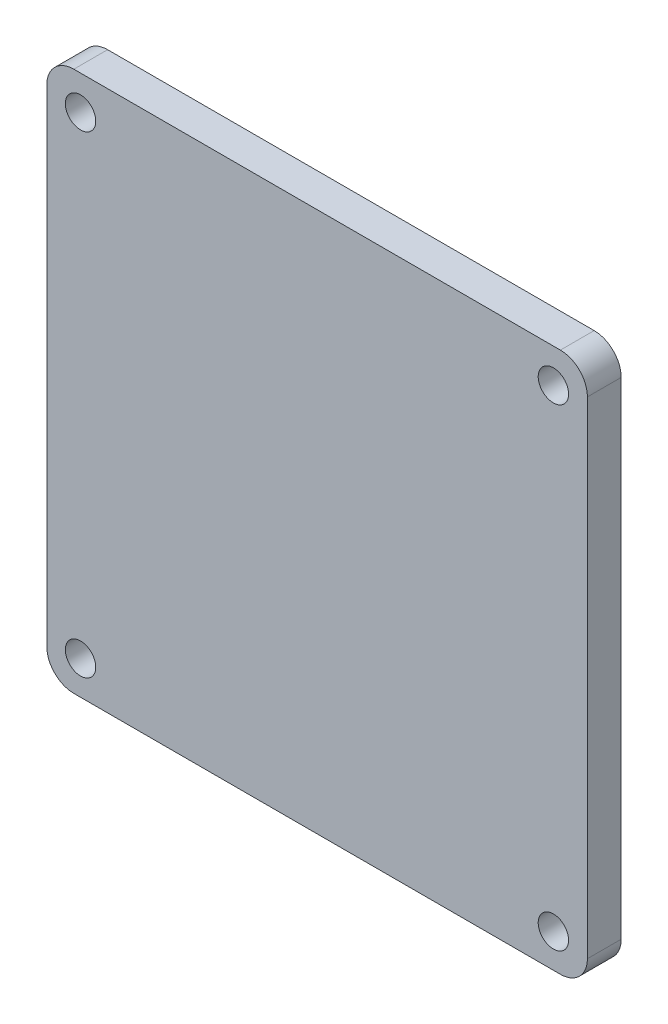
ISO-10303-21;
HEADER;
FILE_DESCRIPTION(('STEP AP214'),'2;1');
FILE_NAME('part.step','',(''),(''),'','','');
FILE_SCHEMA(('AUTOMOTIVE_DESIGN { 1 0 10303 214 1 1 1 1 }'));
ENDSEC;
DATA;
#1=APPLICATION_CONTEXT('core data for automotive mechanical design processes');
#2=APPLICATION_PROTOCOL_DEFINITION('international standard','automotive_design',2000,#1);
#3=PRODUCT_CONTEXT('',#1,'mechanical');
#4=PRODUCT('Part','Part','',(#3));
#5=PRODUCT_RELATED_PRODUCT_CATEGORY('part','',(#4));
#6=PRODUCT_DEFINITION_FORMATION('','',#4);
#7=PRODUCT_DEFINITION_CONTEXT('part definition',#1,'design');
#8=PRODUCT_DEFINITION('design','',#6,#7);
#9=PRODUCT_DEFINITION_SHAPE('','',#8);
#10=(LENGTH_UNIT() NAMED_UNIT(*) SI_UNIT(.MILLI.,.METRE.));
#11=(NAMED_UNIT(*) PLANE_ANGLE_UNIT() SI_UNIT($,.RADIAN.));
#12=(NAMED_UNIT(*) SI_UNIT($,.STERADIAN.) SOLID_ANGLE_UNIT());
#13=UNCERTAINTY_MEASURE_WITH_UNIT(LENGTH_MEASURE(1.E-05),#10,'distance_accuracy_value','');
#14=(GEOMETRIC_REPRESENTATION_CONTEXT(3) GLOBAL_UNCERTAINTY_ASSIGNED_CONTEXT((#13)) GLOBAL_UNIT_ASSIGNED_CONTEXT((#10,
#11,#12)) REPRESENTATION_CONTEXT('',''));
#15=CARTESIAN_POINT('',(0.,0.,0.));
#16=DIRECTION('',(0.,0.,1.));
#17=DIRECTION('',(1.,0.,0.));
#18=AXIS2_PLACEMENT_3D('',#15,#16,#17);
#19=CARTESIAN_POINT('',(-36.,-36.,0.));
#20=DIRECTION('',(0.,0.,-1.));
#21=DIRECTION('',(-1.,0.,0.));
#22=AXIS2_PLACEMENT_3D('',#19,#20,#21);
#23=PLANE('',#22);
#24=CARTESIAN_POINT('',(-35.0076226985767,34.9623801641174,0.));
#25=DIRECTION('',(0.,0.,1.));
#26=DIRECTION('',(1.,0.,0.));
#27=AXIS2_PLACEMENT_3D('',#24,#25,#26);
#28=CIRCLE('',#27,2.24999999999999);
#29=CARTESIAN_POINT('',(-32.7576226985767,34.9623801641174,0.));
#30=VERTEX_POINT('',#29);
#31=EDGE_CURVE('E195',#30,#30,#28,.T.);
#32=ORIENTED_EDGE('',*,*,#31,.T.);
#33=EDGE_LOOP('',(#32));
#34=FACE_BOUND('',#33,.T.);
#35=CARTESIAN_POINT('',(34.9683536446484,34.9623801641172,0.));
#36=DIRECTION('',(0.,0.,1.));
#37=DIRECTION('',(1.,0.,0.));
#38=AXIS2_PLACEMENT_3D('',#35,#36,#37);
#39=CIRCLE('',#38,2.24999999999999);
#40=CARTESIAN_POINT('',(37.2183536446484,34.9623801641172,0.));
#41=VERTEX_POINT('',#40);
#42=EDGE_CURVE('E189',#41,#41,#39,.T.);
#43=ORIENTED_EDGE('',*,*,#42,.T.);
#44=EDGE_LOOP('',(#43));
#45=FACE_BOUND('',#44,.T.);
#46=CARTESIAN_POINT('',(34.9683536446482,-35.0238813325822,0.));
#47=DIRECTION('',(0.,0.,1.));
#48=DIRECTION('',(1.,0.,0.));
#49=AXIS2_PLACEMENT_3D('',#46,#47,#48);
#50=CIRCLE('',#49,2.24999999999999);
#51=CARTESIAN_POINT('',(37.2183536446482,-35.0238813325822,0.));
#52=VERTEX_POINT('',#51);
#53=EDGE_CURVE('E183',#52,#52,#50,.T.);
#54=ORIENTED_EDGE('',*,*,#53,.T.);
#55=EDGE_LOOP('',(#54));
#56=FACE_BOUND('',#55,.T.);
#57=CARTESIAN_POINT('',(-36.,-36.,0.));
#58=DIRECTION('',(0.,0.,1.));
#59=DIRECTION('',(-1.,0.,0.));
#60=AXIS2_PLACEMENT_3D('',#57,#58,#59);
#61=CIRCLE('',#60,4.);
#62=CARTESIAN_POINT('',(-40.,-36.,0.));
#63=VERTEX_POINT('',#62);
#64=CARTESIAN_POINT('',(-36.,-40.,0.));
#65=VERTEX_POINT('',#64);
#66=EDGE_CURVE('E130',#63,#65,#61,.T.);
#67=ORIENTED_EDGE('',*,*,#66,.F.);
#68=DIRECTION('',(0.,-1.,0.));
#69=VECTOR('',#68,1.);
#70=CARTESIAN_POINT('',(-40.,-36.,0.));
#71=LINE('',#70,#69);
#72=CARTESIAN_POINT('',(-40.,36.,0.));
#73=VERTEX_POINT('',#72);
#74=EDGE_CURVE('E85',#73,#63,#71,.T.);
#75=ORIENTED_EDGE('',*,*,#74,.F.);
#76=CARTESIAN_POINT('',(-36.,36.,0.));
#77=DIRECTION('',(0.,0.,1.));
#78=DIRECTION('',(-1.,0.,0.));
#79=AXIS2_PLACEMENT_3D('',#76,#77,#78);
#80=CIRCLE('',#79,4.);
#81=CARTESIAN_POINT('',(-36.,40.,0.));
#82=VERTEX_POINT('',#81);
#83=EDGE_CURVE('E79',#82,#73,#80,.T.);
#84=ORIENTED_EDGE('',*,*,#83,.F.);
#85=DIRECTION('',(-1.,0.,0.));
#86=VECTOR('',#85,1.);
#87=CARTESIAN_POINT('',(-36.,40.,0.));
#88=LINE('',#87,#86);
#89=CARTESIAN_POINT('',(36.,40.,0.));
#90=VERTEX_POINT('',#89);
#91=EDGE_CURVE('E120',#90,#82,#88,.T.);
#92=ORIENTED_EDGE('',*,*,#91,.F.);
#93=CARTESIAN_POINT('',(36.,36.,0.));
#94=DIRECTION('',(0.,0.,1.));
#95=DIRECTION('',(1.,0.,0.));
#96=AXIS2_PLACEMENT_3D('',#93,#94,#95);
#97=CIRCLE('',#96,4.);
#98=CARTESIAN_POINT('',(40.,36.,0.));
#99=VERTEX_POINT('',#98);
#100=EDGE_CURVE('E140',#99,#90,#97,.T.);
#101=ORIENTED_EDGE('',*,*,#100,.F.);
#102=DIRECTION('',(0.,1.,0.));
#103=VECTOR('',#102,1.);
#104=CARTESIAN_POINT('',(40.,-36.,0.));
#105=LINE('',#104,#103);
#106=CARTESIAN_POINT('',(40.,-36.,0.));
#107=VERTEX_POINT('',#106);
#108=EDGE_CURVE('E138',#107,#99,#105,.T.);
#109=ORIENTED_EDGE('',*,*,#108,.F.);
#110=CARTESIAN_POINT('',(36.,-36.,0.));
#111=DIRECTION('',(0.,0.,1.));
#112=DIRECTION('',(1.,0.,0.));
#113=AXIS2_PLACEMENT_3D('',#110,#111,#112);
#114=CIRCLE('',#113,4.);
#115=CARTESIAN_POINT('',(36.,-40.,0.));
#116=VERTEX_POINT('',#115);
#117=EDGE_CURVE('E136',#116,#107,#114,.T.);
#118=ORIENTED_EDGE('',*,*,#117,.F.);
#119=DIRECTION('',(1.,0.,0.));
#120=VECTOR('',#119,1.);
#121=CARTESIAN_POINT('',(-36.,-40.,0.));
#122=LINE('',#121,#120);
#123=EDGE_CURVE('E133',#65,#116,#122,.T.);
#124=ORIENTED_EDGE('',*,*,#123,.F.);
#125=EDGE_LOOP('',(#67,#75,#84,#92,#101,#109,#118,#124));
#126=FACE_BOUND('',#125,.T.);
#127=CARTESIAN_POINT('',(-35.0076226985769,-35.023881332582,0.));
#128=DIRECTION('',(0.,0.,1.));
#129=DIRECTION('',(1.,0.,0.));
#130=AXIS2_PLACEMENT_3D('',#127,#128,#129);
#131=CIRCLE('',#130,2.24999999999999);
#132=CARTESIAN_POINT('',(-32.7576226985769,-35.023881332582,0.));
#133=VERTEX_POINT('',#132);
#134=EDGE_CURVE('E134',#133,#133,#131,.T.);
#135=ORIENTED_EDGE('',*,*,#134,.T.);
#136=EDGE_LOOP('',(#135));
#137=FACE_BOUND('',#136,.T.);
#138=ADVANCED_FACE('F33',(#34,#45,#56,#126,#137),#23,.T.);
#139=CARTESIAN_POINT('',(-36.,-36.,5.));
#140=DIRECTION('',(0.,0.,-1.));
#141=DIRECTION('',(-1.,0.,0.));
#142=AXIS2_PLACEMENT_3D('',#139,#140,#141);
#143=CYLINDRICAL_SURFACE('',#142,4.);
#144=ORIENTED_EDGE('',*,*,#66,.T.);
#145=DIRECTION('',(0.,0.,-1.));
#146=VECTOR('',#145,1.);
#147=CARTESIAN_POINT('',(-36.,-40.,5.));
#148=LINE('',#147,#146);
#149=CARTESIAN_POINT('',(-36.,-40.,5.));
#150=VERTEX_POINT('',#149);
#151=EDGE_CURVE('E11',#150,#65,#148,.T.);
#152=ORIENTED_EDGE('',*,*,#151,.F.);
#153=CARTESIAN_POINT('',(-36.,-36.,5.));
#154=DIRECTION('',(0.,0.,1.));
#155=DIRECTION('',(-1.,0.,0.));
#156=AXIS2_PLACEMENT_3D('',#153,#154,#155);
#157=CIRCLE('',#156,4.);
#158=CARTESIAN_POINT('',(-40.,-36.,5.));
#159=VERTEX_POINT('',#158);
#160=EDGE_CURVE('E145',#159,#150,#157,.T.);
#161=ORIENTED_EDGE('',*,*,#160,.F.);
#162=DIRECTION('',(0.,0.,-1.));
#163=VECTOR('',#162,1.);
#164=CARTESIAN_POINT('',(-40.,-36.,5.));
#165=LINE('',#164,#163);
#166=EDGE_CURVE('E126',#159,#63,#165,.T.);
#167=ORIENTED_EDGE('',*,*,#166,.T.);
#168=EDGE_LOOP('',(#144,#152,#161,#167));
#169=FACE_BOUND('',#168,.T.);
#170=ADVANCED_FACE('F35',(#169),#143,.T.);
#171=CARTESIAN_POINT('',(-36.,-40.,5.));
#172=DIRECTION('',(0.,1.,0.));
#173=DIRECTION('',(0.,0.,1.));
#174=AXIS2_PLACEMENT_3D('',#171,#172,#173);
#175=PLANE('',#174);
#176=ORIENTED_EDGE('',*,*,#123,.T.);
#177=DIRECTION('',(0.,0.,-1.));
#178=VECTOR('',#177,1.);
#179=CARTESIAN_POINT('',(36.,-40.,5.));
#180=LINE('',#179,#178);
#181=CARTESIAN_POINT('',(36.,-40.,5.));
#182=VERTEX_POINT('',#181);
#183=EDGE_CURVE('E42',#182,#116,#180,.T.);
#184=ORIENTED_EDGE('',*,*,#183,.F.);
#185=DIRECTION('',(1.,0.,0.));
#186=VECTOR('',#185,1.);
#187=CARTESIAN_POINT('',(-36.,-40.,5.));
#188=LINE('',#187,#186);
#189=EDGE_CURVE('E93',#150,#182,#188,.T.);
#190=ORIENTED_EDGE('',*,*,#189,.F.);
#191=ORIENTED_EDGE('',*,*,#151,.T.);
#192=EDGE_LOOP('',(#176,#184,#190,#191));
#193=FACE_BOUND('',#192,.T.);
#194=ADVANCED_FACE('F234',(#193),#175,.F.);
#195=CARTESIAN_POINT('',(36.,-36.,5.));
#196=DIRECTION('',(0.,0.,-1.));
#197=DIRECTION('',(-1.,0.,0.));
#198=AXIS2_PLACEMENT_3D('',#195,#196,#197);
#199=CYLINDRICAL_SURFACE('',#198,4.);
#200=ORIENTED_EDGE('',*,*,#117,.T.);
#201=DIRECTION('',(0.,0.,-1.));
#202=VECTOR('',#201,1.);
#203=CARTESIAN_POINT('',(40.,-36.,5.));
#204=LINE('',#203,#202);
#205=CARTESIAN_POINT('',(40.,-36.,5.));
#206=VERTEX_POINT('',#205);
#207=EDGE_CURVE('E152',#206,#107,#204,.T.);
#208=ORIENTED_EDGE('',*,*,#207,.F.);
#209=CARTESIAN_POINT('',(36.,-36.,5.));
#210=DIRECTION('',(0.,0.,1.));
#211=DIRECTION('',(1.,0.,0.));
#212=AXIS2_PLACEMENT_3D('',#209,#210,#211);
#213=CIRCLE('',#212,4.);
#214=EDGE_CURVE('E160',#182,#206,#213,.T.);
#215=ORIENTED_EDGE('',*,*,#214,.F.);
#216=ORIENTED_EDGE('',*,*,#183,.T.);
#217=EDGE_LOOP('',(#200,#208,#215,#216));
#218=FACE_BOUND('',#217,.T.);
#219=ADVANCED_FACE('F158',(#218),#199,.T.);
#220=CARTESIAN_POINT('',(40.,-36.,5.));
#221=DIRECTION('',(-1.,0.,0.));
#222=DIRECTION('',(0.,0.,1.));
#223=AXIS2_PLACEMENT_3D('',#220,#221,#222);
#224=PLANE('',#223);
#225=ORIENTED_EDGE('',*,*,#108,.T.);
#226=DIRECTION('',(0.,0.,-1.));
#227=VECTOR('',#226,1.);
#228=CARTESIAN_POINT('',(40.,36.,5.));
#229=LINE('',#228,#227);
#230=CARTESIAN_POINT('',(40.,36.,5.));
#231=VERTEX_POINT('',#230);
#232=EDGE_CURVE('E149',#231,#99,#229,.T.);
#233=ORIENTED_EDGE('',*,*,#232,.F.);
#234=DIRECTION('',(0.,1.,0.));
#235=VECTOR('',#234,1.);
#236=CARTESIAN_POINT('',(40.,-36.,5.));
#237=LINE('',#236,#235);
#238=EDGE_CURVE('E172',#206,#231,#237,.T.);
#239=ORIENTED_EDGE('',*,*,#238,.F.);
#240=ORIENTED_EDGE('',*,*,#207,.T.);
#241=EDGE_LOOP('',(#225,#233,#239,#240));
#242=FACE_BOUND('',#241,.T.);
#243=ADVANCED_FACE('F168',(#242),#224,.F.);
#244=CARTESIAN_POINT('',(36.,36.,5.));
#245=DIRECTION('',(0.,0.,-1.));
#246=DIRECTION('',(-1.,0.,0.));
#247=AXIS2_PLACEMENT_3D('',#244,#245,#246);
#248=CYLINDRICAL_SURFACE('',#247,4.);
#249=ORIENTED_EDGE('',*,*,#100,.T.);
#250=DIRECTION('',(0.,0.,-1.));
#251=VECTOR('',#250,1.);
#252=CARTESIAN_POINT('',(36.,40.,5.));
#253=LINE('',#252,#251);
#254=CARTESIAN_POINT('',(36.,40.,5.));
#255=VERTEX_POINT('',#254);
#256=EDGE_CURVE('E121',#255,#90,#253,.T.);
#257=ORIENTED_EDGE('',*,*,#256,.F.);
#258=CARTESIAN_POINT('',(36.,36.,5.));
#259=DIRECTION('',(0.,0.,1.));
#260=DIRECTION('',(1.,0.,0.));
#261=AXIS2_PLACEMENT_3D('',#258,#259,#260);
#262=CIRCLE('',#261,4.);
#263=EDGE_CURVE('E112',#231,#255,#262,.T.);
#264=ORIENTED_EDGE('',*,*,#263,.F.);
#265=ORIENTED_EDGE('',*,*,#232,.T.);
#266=EDGE_LOOP('',(#249,#257,#264,#265));
#267=FACE_BOUND('',#266,.T.);
#268=ADVANCED_FACE('F171',(#267),#248,.T.);
#269=CARTESIAN_POINT('',(-36.,40.,5.));
#270=DIRECTION('',(0.,-1.,0.));
#271=DIRECTION('',(0.,0.,-1.));
#272=AXIS2_PLACEMENT_3D('',#269,#270,#271);
#273=PLANE('',#272);
#274=ORIENTED_EDGE('',*,*,#91,.T.);
#275=DIRECTION('',(0.,0.,-1.));
#276=VECTOR('',#275,1.);
#277=CARTESIAN_POINT('',(-36.,40.,5.));
#278=LINE('',#277,#276);
#279=CARTESIAN_POINT('',(-36.,40.,5.));
#280=VERTEX_POINT('',#279);
#281=EDGE_CURVE('E117',#280,#82,#278,.T.);
#282=ORIENTED_EDGE('',*,*,#281,.F.);
#283=DIRECTION('',(-1.,0.,0.));
#284=VECTOR('',#283,1.);
#285=CARTESIAN_POINT('',(-36.,40.,5.));
#286=LINE('',#285,#284);
#287=EDGE_CURVE('E106',#255,#280,#286,.T.);
#288=ORIENTED_EDGE('',*,*,#287,.F.);
#289=ORIENTED_EDGE('',*,*,#256,.T.);
#290=EDGE_LOOP('',(#274,#282,#288,#289));
#291=FACE_BOUND('',#290,.T.);
#292=ADVANCED_FACE('F118',(#291),#273,.F.);
#293=CARTESIAN_POINT('',(-36.,36.,5.));
#294=DIRECTION('',(0.,0.,-1.));
#295=DIRECTION('',(-1.,0.,0.));
#296=AXIS2_PLACEMENT_3D('',#293,#294,#295);
#297=CYLINDRICAL_SURFACE('',#296,4.);
#298=ORIENTED_EDGE('',*,*,#83,.T.);
#299=DIRECTION('',(0.,0.,-1.));
#300=VECTOR('',#299,1.);
#301=CARTESIAN_POINT('',(-40.,36.,5.));
#302=LINE('',#301,#300);
#303=CARTESIAN_POINT('',(-40.,36.,5.));
#304=VERTEX_POINT('',#303);
#305=EDGE_CURVE('E122',#304,#73,#302,.T.);
#306=ORIENTED_EDGE('',*,*,#305,.F.);
#307=CARTESIAN_POINT('',(-36.,36.,5.));
#308=DIRECTION('',(0.,0.,1.));
#309=DIRECTION('',(-1.,0.,0.));
#310=AXIS2_PLACEMENT_3D('',#307,#308,#309);
#311=CIRCLE('',#310,4.);
#312=EDGE_CURVE('E110',#280,#304,#311,.T.);
#313=ORIENTED_EDGE('',*,*,#312,.F.);
#314=ORIENTED_EDGE('',*,*,#281,.T.);
#315=EDGE_LOOP('',(#298,#306,#313,#314));
#316=FACE_BOUND('',#315,.T.);
#317=ADVANCED_FACE('F124',(#316),#297,.T.);
#318=CARTESIAN_POINT('',(-40.,-36.,5.));
#319=DIRECTION('',(1.,0.,0.));
#320=DIRECTION('',(0.,0.,-1.));
#321=AXIS2_PLACEMENT_3D('',#318,#319,#320);
#322=PLANE('',#321);
#323=ORIENTED_EDGE('',*,*,#74,.T.);
#324=ORIENTED_EDGE('',*,*,#166,.F.);
#325=DIRECTION('',(0.,-1.,0.));
#326=VECTOR('',#325,1.);
#327=CARTESIAN_POINT('',(-40.,-36.,5.));
#328=LINE('',#327,#326);
#329=EDGE_CURVE('E50',#304,#159,#328,.T.);
#330=ORIENTED_EDGE('',*,*,#329,.F.);
#331=ORIENTED_EDGE('',*,*,#305,.T.);
#332=EDGE_LOOP('',(#323,#324,#330,#331));
#333=FACE_BOUND('',#332,.T.);
#334=ADVANCED_FACE('F207',(#333),#322,.F.);
#335=CARTESIAN_POINT('',(-36.,-36.,5.));
#336=DIRECTION('',(0.,0.,-1.));
#337=DIRECTION('',(-1.,0.,0.));
#338=AXIS2_PLACEMENT_3D('',#335,#336,#337);
#339=PLANE('',#338);
#340=CARTESIAN_POINT('',(-35.0076226985767,34.9623801641174,5.));
#341=DIRECTION('',(0.,0.,1.));
#342=DIRECTION('',(1.,0.,0.));
#343=AXIS2_PLACEMENT_3D('',#340,#341,#342);
#344=CIRCLE('',#343,2.24999999999999);
#345=CARTESIAN_POINT('',(-32.7576226985767,34.9623801641174,5.));
#346=VERTEX_POINT('',#345);
#347=EDGE_CURVE('E198',#346,#346,#344,.T.);
#348=ORIENTED_EDGE('',*,*,#347,.F.);
#349=EDGE_LOOP('',(#348));
#350=FACE_BOUND('',#349,.T.);
#351=CARTESIAN_POINT('',(34.9683536446484,34.9623801641172,5.));
#352=DIRECTION('',(0.,0.,1.));
#353=DIRECTION('',(1.,0.,0.));
#354=AXIS2_PLACEMENT_3D('',#351,#352,#353);
#355=CIRCLE('',#354,2.24999999999999);
#356=CARTESIAN_POINT('',(37.2183536446484,34.9623801641172,5.));
#357=VERTEX_POINT('',#356);
#358=EDGE_CURVE('E192',#357,#357,#355,.T.);
#359=ORIENTED_EDGE('',*,*,#358,.F.);
#360=EDGE_LOOP('',(#359));
#361=FACE_BOUND('',#360,.T.);
#362=CARTESIAN_POINT('',(34.9683536446482,-35.0238813325822,5.));
#363=DIRECTION('',(0.,0.,1.));
#364=DIRECTION('',(1.,0.,0.));
#365=AXIS2_PLACEMENT_3D('',#362,#363,#364);
#366=CIRCLE('',#365,2.24999999999999);
#367=CARTESIAN_POINT('',(37.2183536446482,-35.0238813325822,5.));
#368=VERTEX_POINT('',#367);
#369=EDGE_CURVE('E186',#368,#368,#366,.T.);
#370=ORIENTED_EDGE('',*,*,#369,.F.);
#371=EDGE_LOOP('',(#370));
#372=FACE_BOUND('',#371,.T.);
#373=CARTESIAN_POINT('',(-35.0076226985769,-35.023881332582,5.));
#374=DIRECTION('',(0.,0.,1.));
#375=DIRECTION('',(1.,0.,0.));
#376=AXIS2_PLACEMENT_3D('',#373,#374,#375);
#377=CIRCLE('',#376,2.24999999999999);
#378=CARTESIAN_POINT('',(-32.7576226985769,-35.023881332582,5.));
#379=VERTEX_POINT('',#378);
#380=EDGE_CURVE('E180',#379,#379,#377,.T.);
#381=ORIENTED_EDGE('',*,*,#380,.F.);
#382=EDGE_LOOP('',(#381));
#383=FACE_BOUND('',#382,.T.);
#384=ORIENTED_EDGE('',*,*,#160,.T.);
#385=ORIENTED_EDGE('',*,*,#189,.T.);
#386=ORIENTED_EDGE('',*,*,#214,.T.);
#387=ORIENTED_EDGE('',*,*,#238,.T.);
#388=ORIENTED_EDGE('',*,*,#263,.T.);
#389=ORIENTED_EDGE('',*,*,#287,.T.);
#390=ORIENTED_EDGE('',*,*,#312,.T.);
#391=ORIENTED_EDGE('',*,*,#329,.T.);
#392=EDGE_LOOP('',(#384,#385,#386,#387,#388,#389,#390,#391));
#393=FACE_BOUND('',#392,.T.);
#394=ADVANCED_FACE('F108',(#350,#361,#372,#383,#393),#339,.F.);
#395=CARTESIAN_POINT('',(-35.0076226985769,-35.023881332582,5.));
#396=DIRECTION('',(0.,0.,1.));
#397=DIRECTION('',(1.,0.,0.));
#398=AXIS2_PLACEMENT_3D('',#395,#396,#397);
#399=CYLINDRICAL_SURFACE('',#398,2.24999999999999);
#400=ORIENTED_EDGE('',*,*,#134,.F.);
#401=EDGE_LOOP('',(#400));
#402=FACE_BOUND('',#401,.T.);
#403=ORIENTED_EDGE('',*,*,#380,.T.);
#404=EDGE_LOOP('',(#403));
#405=FACE_BOUND('',#404,.T.);
#406=ADVANCED_FACE('F206',(#402,#405),#399,.F.);
#407=CARTESIAN_POINT('',(34.9683536446482,-35.0238813325822,5.));
#408=DIRECTION('',(0.,0.,1.));
#409=DIRECTION('',(1.,0.,0.));
#410=AXIS2_PLACEMENT_3D('',#407,#408,#409);
#411=CYLINDRICAL_SURFACE('',#410,2.24999999999999);
#412=ORIENTED_EDGE('',*,*,#53,.F.);
#413=EDGE_LOOP('',(#412));
#414=FACE_BOUND('',#413,.T.);
#415=ORIENTED_EDGE('',*,*,#369,.T.);
#416=EDGE_LOOP('',(#415));
#417=FACE_BOUND('',#416,.T.);
#418=ADVANCED_FACE('F216',(#414,#417),#411,.F.);
#419=CARTESIAN_POINT('',(34.9683536446484,34.9623801641172,5.));
#420=DIRECTION('',(0.,0.,1.));
#421=DIRECTION('',(1.,0.,0.));
#422=AXIS2_PLACEMENT_3D('',#419,#420,#421);
#423=CYLINDRICAL_SURFACE('',#422,2.24999999999999);
#424=ORIENTED_EDGE('',*,*,#42,.F.);
#425=EDGE_LOOP('',(#424));
#426=FACE_BOUND('',#425,.T.);
#427=ORIENTED_EDGE('',*,*,#358,.T.);
#428=EDGE_LOOP('',(#427));
#429=FACE_BOUND('',#428,.T.);
#430=ADVANCED_FACE('F223',(#426,#429),#423,.F.);
#431=CARTESIAN_POINT('',(-35.0076226985767,34.9623801641174,5.));
#432=DIRECTION('',(0.,0.,1.));
#433=DIRECTION('',(1.,0.,0.));
#434=AXIS2_PLACEMENT_3D('',#431,#432,#433);
#435=CYLINDRICAL_SURFACE('',#434,2.24999999999999);
#436=ORIENTED_EDGE('',*,*,#31,.F.);
#437=EDGE_LOOP('',(#436));
#438=FACE_BOUND('',#437,.T.);
#439=ORIENTED_EDGE('',*,*,#347,.T.);
#440=EDGE_LOOP('',(#439));
#441=FACE_BOUND('',#440,.T.);
#442=ADVANCED_FACE('F202',(#438,#441),#435,.F.);
#443=CLOSED_SHELL('',(#138,#170,#194,#219,#243,#268,#292,#317,#334,#394,#406,#418,#430,#442));
#444=MANIFOLD_SOLID_BREP('B2',#443);
#445=ADVANCED_BREP_SHAPE_REPRESENTATION('',(#18,#444),#14);
#446=SHAPE_DEFINITION_REPRESENTATION(#9,#445);
ENDSEC;
END-ISO-10303-21;
